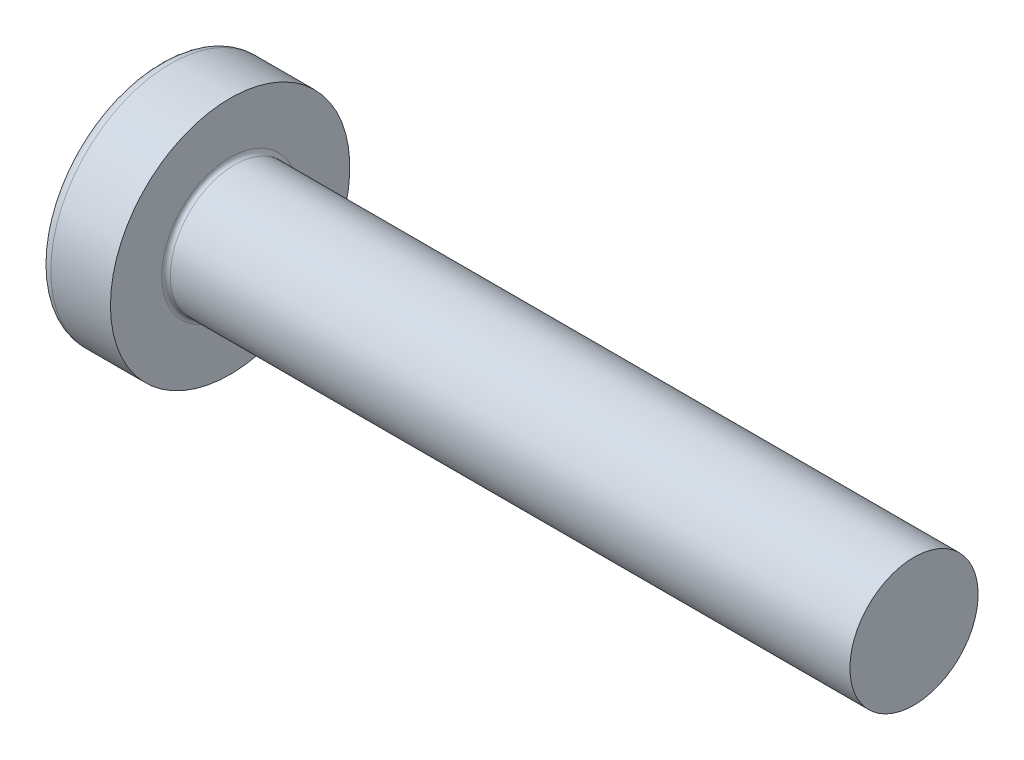
ISO-10303-21;
HEADER;
FILE_DESCRIPTION(('STEP AP214'),'2;1');
FILE_NAME('part.step','',(''),(''),'','','');
FILE_SCHEMA(('AUTOMOTIVE_DESIGN { 1 0 10303 214 1 1 1 1 }'));
ENDSEC;
DATA;
#1=APPLICATION_CONTEXT('core data for automotive mechanical design processes');
#2=APPLICATION_PROTOCOL_DEFINITION('international standard','automotive_design',2000,#1);
#3=PRODUCT_CONTEXT('',#1,'mechanical');
#4=PRODUCT('Part','Part','',(#3));
#5=PRODUCT_RELATED_PRODUCT_CATEGORY('part','',(#4));
#6=PRODUCT_DEFINITION_FORMATION('','',#4);
#7=PRODUCT_DEFINITION_CONTEXT('part definition',#1,'design');
#8=PRODUCT_DEFINITION('design','',#6,#7);
#9=PRODUCT_DEFINITION_SHAPE('','',#8);
#10=(LENGTH_UNIT() NAMED_UNIT(*) SI_UNIT(.MILLI.,.METRE.));
#11=(NAMED_UNIT(*) PLANE_ANGLE_UNIT() SI_UNIT($,.RADIAN.));
#12=(NAMED_UNIT(*) SI_UNIT($,.STERADIAN.) SOLID_ANGLE_UNIT());
#13=UNCERTAINTY_MEASURE_WITH_UNIT(LENGTH_MEASURE(1.E-05),#10,'distance_accuracy_value','');
#14=(GEOMETRIC_REPRESENTATION_CONTEXT(3) GLOBAL_UNCERTAINTY_ASSIGNED_CONTEXT((#13)) GLOBAL_UNIT_ASSIGNED_CONTEXT((#10,
#11,#12)) REPRESENTATION_CONTEXT('',''));
#15=CARTESIAN_POINT('',(0.,0.,0.));
#16=DIRECTION('',(0.,0.,1.));
#17=DIRECTION('',(1.,0.,0.));
#18=AXIS2_PLACEMENT_3D('',#15,#16,#17);
#19=CARTESIAN_POINT('',(5.,0.,0.));
#20=DIRECTION('',(-1.,0.,0.));
#21=DIRECTION('',(0.,1.,0.));
#22=AXIS2_PLACEMENT_3D('',#19,#20,#21);
#23=SPHERICAL_SURFACE('',#22,5.);
#24=CARTESIAN_POINT('',(0.775371598933736,0.,0.));
#25=DIRECTION('',(-1.,0.,0.));
#26=DIRECTION('',(0.,0.,1.));
#27=AXIS2_PLACEMENT_3D('',#24,#25,#26);
#28=CIRCLE('',#27,2.67441860465116);
#29=CARTESIAN_POINT('',(0.775371598933736,0.,2.67441860465116));
#30=VERTEX_POINT('',#29);
#31=EDGE_CURVE('E237',#30,#30,#28,.T.);
#32=ORIENTED_EDGE('',*,*,#31,.T.);
#33=EDGE_LOOP('',(#32));
#34=FACE_BOUND('',#33,.T.);
#35=CARTESIAN_POINT('',(0.0457951200896452,0.,0.));
#36=DIRECTION('',(1.,0.,0.));
#37=DIRECTION('',(0.,0.,-1.));
#38=AXIS2_PLACEMENT_3D('',#35,#36,#37);
#39=CIRCLE('',#38,0.675169614150692);
#40=CARTESIAN_POINT('',(0.0457951200896426,-0.369999999999998,-0.564760133040919));
#41=VERTEX_POINT('',#40);
#42=CARTESIAN_POINT('',(0.0457951200896452,-0.564760133040931,-0.37));
#43=VERTEX_POINT('',#42);
#44=EDGE_CURVE('E373',#41,#43,#39,.F.);
#45=ORIENTED_EDGE('',*,*,#44,.F.);
#46=CARTESIAN_POINT('',(5.,-0.37,0.));
#47=DIRECTION('',(0.,1.,0.));
#48=DIRECTION('',(0.,0.,1.));
#49=AXIS2_PLACEMENT_3D('',#46,#47,#48);
#50=CIRCLE('',#49,4.98629120689917);
#51=CARTESIAN_POINT('',(0.18786973422864,-0.369999999999995,-1.30633162146802));
#52=VERTEX_POINT('',#51);
#53=EDGE_CURVE('E299',#52,#41,#50,.T.);
#54=ORIENTED_EDGE('',*,*,#53,.F.);
#55=CARTESIAN_POINT('',(4.56358262530798,0.,0.875317983305918));
#56=DIRECTION('',(0.446197753347436,0.,-0.894934391398443));
#57=DIRECTION('',(-0.894934391398443,0.,-0.446197753347436));
#58=AXIS2_PLACEMENT_3D('',#55,#56,#57);
#59=CIRCLE('',#58,4.90340272700175);
#60=CARTESIAN_POINT('',(0.187869734228642,0.370000000000005,-1.30633162146801));
#61=VERTEX_POINT('',#60);
#62=EDGE_CURVE('E271',#52,#61,#59,.T.);
#63=ORIENTED_EDGE('',*,*,#62,.T.);
#64=CARTESIAN_POINT('',(5.,0.37,0.));
#65=DIRECTION('',(0.,-1.,0.));
#66=DIRECTION('',(0.,0.,-1.));
#67=AXIS2_PLACEMENT_3D('',#64,#65,#66);
#68=CIRCLE('',#67,4.98629120689917);
#69=CARTESIAN_POINT('',(0.0457951200896447,0.370000000000002,-0.564760133040916));
#70=VERTEX_POINT('',#69);
#71=EDGE_CURVE('E326',#70,#61,#68,.T.);
#72=ORIENTED_EDGE('',*,*,#71,.F.);
#73=CARTESIAN_POINT('',(0.0457951200896452,0.564760133040921,-0.37));
#74=VERTEX_POINT('',#73);
#75=EDGE_CURVE('E392',#74,#70,#39,.F.);
#76=ORIENTED_EDGE('',*,*,#75,.F.);
#77=CARTESIAN_POINT('',(5.,0.,-0.37));
#78=DIRECTION('',(0.,0.,1.));
#79=DIRECTION('',(1.,0.,0.));
#80=AXIS2_PLACEMENT_3D('',#77,#78,#79);
#81=CIRCLE('',#80,4.98629120689917);
#82=CARTESIAN_POINT('',(0.187869734228643,1.30633162146802,-0.37));
#83=VERTEX_POINT('',#82);
#84=EDGE_CURVE('E265',#83,#74,#81,.T.);
#85=ORIENTED_EDGE('',*,*,#84,.F.);
#86=CARTESIAN_POINT('',(4.56358262530798,-0.875317983305921,0.));
#87=DIRECTION('',(0.446197753347436,0.894934391398442,0.));
#88=DIRECTION('',(-0.894934391398442,0.446197753347436,0.));
#89=AXIS2_PLACEMENT_3D('',#86,#87,#88);
#90=CIRCLE('',#89,4.90340272700175);
#91=CARTESIAN_POINT('',(0.187869734228642,1.30633162146802,0.37));
#92=VERTEX_POINT('',#91);
#93=EDGE_CURVE('E268',#83,#92,#90,.T.);
#94=ORIENTED_EDGE('',*,*,#93,.T.);
#95=CARTESIAN_POINT('',(5.,0.,0.37));
#96=DIRECTION('',(0.,0.,-1.));
#97=DIRECTION('',(0.,1.,0.));
#98=AXIS2_PLACEMENT_3D('',#95,#96,#97);
#99=CIRCLE('',#98,4.98629120689917);
#100=CARTESIAN_POINT('',(0.0457951200896452,0.564760133040921,0.37));
#101=VERTEX_POINT('',#100);
#102=EDGE_CURVE('E261',#101,#92,#99,.T.);
#103=ORIENTED_EDGE('',*,*,#102,.F.);
#104=CARTESIAN_POINT('',(0.0457951200896452,0.369999999999998,0.564760133040918));
#105=VERTEX_POINT('',#104);
#106=EDGE_CURVE('E391',#105,#101,#39,.F.);
#107=ORIENTED_EDGE('',*,*,#106,.F.);
#108=CARTESIAN_POINT('',(0.187869734228642,0.369999999999995,1.30633162146802));
#109=VERTEX_POINT('',#108);
#110=EDGE_CURVE('E281',#109,#105,#68,.T.);
#111=ORIENTED_EDGE('',*,*,#110,.F.);
#112=CARTESIAN_POINT('',(4.56358262530798,0.,-0.87531798330592));
#113=DIRECTION('',(0.446197753347436,0.,0.894934391398442));
#114=DIRECTION('',(0.894934391398442,0.,-0.446197753347436));
#115=AXIS2_PLACEMENT_3D('',#112,#113,#114);
#116=CIRCLE('',#115,4.90340272700175);
#117=CARTESIAN_POINT('',(0.18786973422864,-0.370000000000004,1.30633162146802));
#118=VERTEX_POINT('',#117);
#119=EDGE_CURVE('E48',#109,#118,#116,.T.);
#120=ORIENTED_EDGE('',*,*,#119,.T.);
#121=CARTESIAN_POINT('',(0.0457951200896416,-0.370000000000002,0.564760133040916));
#122=VERTEX_POINT('',#121);
#123=EDGE_CURVE('E278',#122,#118,#50,.T.);
#124=ORIENTED_EDGE('',*,*,#123,.F.);
#125=CARTESIAN_POINT('',(0.0457951200896452,-0.564760133040931,0.37));
#126=VERTEX_POINT('',#125);
#127=EDGE_CURVE('E431',#126,#122,#39,.F.);
#128=ORIENTED_EDGE('',*,*,#127,.F.);
#129=CARTESIAN_POINT('',(0.187869734228639,-1.30633162146802,0.37));
#130=VERTEX_POINT('',#129);
#131=EDGE_CURVE('E262',#130,#126,#99,.T.);
#132=ORIENTED_EDGE('',*,*,#131,.F.);
#133=CARTESIAN_POINT('',(4.56358262530798,0.875317983305917,0.));
#134=DIRECTION('',(0.446197753347436,-0.894934391398443,0.));
#135=DIRECTION('',(0.894934391398443,0.446197753347436,0.));
#136=AXIS2_PLACEMENT_3D('',#133,#134,#135);
#137=CIRCLE('',#136,4.90340272700175);
#138=CARTESIAN_POINT('',(0.187869734228639,-1.30633162146802,-0.37));
#139=VERTEX_POINT('',#138);
#140=EDGE_CURVE('E258',#130,#139,#137,.T.);
#141=ORIENTED_EDGE('',*,*,#140,.T.);
#142=EDGE_CURVE('E63',#43,#139,#81,.T.);
#143=ORIENTED_EDGE('',*,*,#142,.F.);
#144=EDGE_LOOP('',(#45,#54,#63,#72,#76,#85,#94,#103,#107,#111,#120,#124,#128,#132,#141,#143));
#145=FACE_BOUND('',#144,.T.);
#146=ADVANCED_FACE('F34',(#34,#145),#23,.T.);
#147=CARTESIAN_POINT('',(1.75,0.527482331818931,-0.37));
#148=DIRECTION('',(0.,0.,1.));
#149=DIRECTION('',(1.,0.,0.));
#150=AXIS2_PLACEMENT_3D('',#147,#148,#149);
#151=PLANE('',#150);
#152=ORIENTED_EDGE('',*,*,#84,.T.);
#153=CARTESIAN_POINT('',(-0.987293237053714,0.649401255967161,-0.37));
#154=CARTESIAN_POINT('',(-0.781914975317082,0.632865887002871,-0.37));
#155=CARTESIAN_POINT('',(-0.57654788239337,0.616188977635081,-0.37));
#156=CARTESIAN_POINT('',(-0.165841599226325,0.582441031964227,-0.37));
#157=CARTESIAN_POINT('',(0.0394975903090468,0.565369987054879,-0.37));
#158=CARTESIAN_POINT('',(0.450133475422574,0.530723441326535,-0.37));
#159=CARTESIAN_POINT('',(0.655430171010575,0.513147940624557,-0.37));
#160=CARTESIAN_POINT('',(1.06596140177934,0.477314957985794,-0.37));
#161=CARTESIAN_POINT('',(1.27119593780711,0.459057485806066,-0.37));
#162=CARTESIAN_POINT('',(1.61065292365626,0.428051938688768,-0.37));
#163=CARTESIAN_POINT('',(1.74490059995643,0.415580824990931,-0.37));
#164=CARTESIAN_POINT('',(2.01334321762763,0.390092023404979,-0.37));
#165=CARTESIAN_POINT('',(2.14753815934577,0.377074339177353,-0.37));
#166=CARTESIAN_POINT('',(2.41586354151957,0.350315629452842,-0.37));
#167=CARTESIAN_POINT('',(2.5499939784531,0.33657456817765,-0.37));
#168=CARTESIAN_POINT('',(2.81814173295471,0.308004077741875,-0.37));
#169=CARTESIAN_POINT('',(2.95215904765134,0.293174621747065,-0.37));
#170=CARTESIAN_POINT('',(3.0860955068368,0.277618485071816,-0.37));
#171=B_SPLINE_CURVE_WITH_KNOTS('',3,(#153,#154,#155,#156,#157,#158,#159,#160,#161,#162,#163,
#164,#165,#166,#167,#168,#169,#170),.UNSPECIFIED.,.F.,.F.,(4,2,2,2,2,2,2,2,4),(0.,
0.618128793984691,1.23627109812525,1.85441325887562,2.4725465791681,2.87702276218609,
3.28149623678161,3.68598973550942,4.09049321032311),.UNSPECIFIED.);
#172=CARTESIAN_POINT('',(1.75,0.415013252800437,-0.37));
#173=VERTEX_POINT('',#172);
#174=EDGE_CURVE('E415',#74,#173,#171,.T.);
#175=ORIENTED_EDGE('',*,*,#174,.T.);
#176=DIRECTION('',(0.,1.,0.));
#177=VECTOR('',#176,1.);
#178=CARTESIAN_POINT('',(1.75,-0.527482331818931,-0.37));
#179=LINE('',#178,#177);
#180=CARTESIAN_POINT('',(1.75,0.527482331818931,-0.37));
#181=VERTEX_POINT('',#180);
#182=EDGE_CURVE('E355',#173,#181,#179,.T.);
#183=ORIENTED_EDGE('',*,*,#182,.T.);
#184=DIRECTION('',(0.894934391398442,-0.446197753347436,0.));
#185=VECTOR('',#184,1.);
#186=CARTESIAN_POINT('',(0.,1.4,-0.37));
#187=LINE('',#186,#185);
#188=EDGE_CURVE('E238',#83,#181,#187,.T.);
#189=ORIENTED_EDGE('',*,*,#188,.F.);
#190=EDGE_LOOP('',(#152,#175,#183,#189));
#191=FACE_BOUND('',#190,.T.);
#192=ADVANCED_FACE('F193',(#191),#151,.T.);
#193=CARTESIAN_POINT('',(1.75,-0.527482331818931,-0.37));
#194=VERTEX_POINT('',#193);
#195=CARTESIAN_POINT('',(1.75,-0.415013252800437,-0.37));
#196=VERTEX_POINT('',#195);
#197=EDGE_CURVE('E246',#194,#196,#179,.T.);
#198=ORIENTED_EDGE('',*,*,#197,.T.);
#199=CARTESIAN_POINT('',(-0.987293237053716,-0.649401255967161,-0.37));
#200=CARTESIAN_POINT('',(-0.781914975317084,-0.632865887002871,-0.37));
#201=CARTESIAN_POINT('',(-0.576547882393373,-0.616188977635081,-0.37));
#202=CARTESIAN_POINT('',(-0.165841599226327,-0.582441031964227,-0.37));
#203=CARTESIAN_POINT('',(0.0394975903090452,-0.565369987054879,-0.37));
#204=CARTESIAN_POINT('',(0.450133475422572,-0.530723441326535,-0.37));
#205=CARTESIAN_POINT('',(0.655430171010574,-0.513147940624557,-0.37));
#206=CARTESIAN_POINT('',(1.06596140177934,-0.477314957985794,-0.37));
#207=CARTESIAN_POINT('',(1.2711959378071,-0.459057485806066,-0.37));
#208=CARTESIAN_POINT('',(1.61065292365626,-0.428051938688768,-0.37));
#209=CARTESIAN_POINT('',(1.74490059995643,-0.415580824990931,-0.37));
#210=CARTESIAN_POINT('',(2.01334321762763,-0.390092023404979,-0.37));
#211=CARTESIAN_POINT('',(2.14753815934577,-0.377074339177353,-0.37));
#212=CARTESIAN_POINT('',(2.41586354151957,-0.350315629452842,-0.37));
#213=CARTESIAN_POINT('',(2.5499939784531,-0.33657456817765,-0.37));
#214=CARTESIAN_POINT('',(2.81814173295471,-0.308004077741875,-0.37));
#215=CARTESIAN_POINT('',(2.95215904765134,-0.293174621747065,-0.37));
#216=CARTESIAN_POINT('',(3.0860955068368,-0.277618485071816,-0.37));
#217=B_SPLINE_CURVE_WITH_KNOTS('',3,(#199,#200,#201,#202,#203,#204,#205,#206,#207,#208,#209,
#210,#211,#212,#213,#214,#215,#216),.UNSPECIFIED.,.F.,.F.,(4,2,2,2,2,2,2,2,4),(0.,
0.618128793984691,1.23627109812525,1.85441325887562,2.4725465791681,2.87702276218609,
3.28149623678161,3.68598973550942,4.09049321032311),.UNSPECIFIED.);
#218=EDGE_CURVE('E390',#196,#43,#217,.F.);
#219=ORIENTED_EDGE('',*,*,#218,.T.);
#220=ORIENTED_EDGE('',*,*,#142,.T.);
#221=DIRECTION('',(0.894934391398443,0.446197753347436,0.));
#222=VECTOR('',#221,1.);
#223=CARTESIAN_POINT('',(0.,-1.4,-0.37));
#224=LINE('',#223,#222);
#225=EDGE_CURVE('E329',#139,#194,#224,.T.);
#226=ORIENTED_EDGE('',*,*,#225,.T.);
#227=EDGE_LOOP('',(#198,#219,#220,#226));
#228=FACE_BOUND('',#227,.T.);
#229=ADVANCED_FACE('F199',(#228),#151,.T.);
#230=CARTESIAN_POINT('',(1.75,-0.527482331818932,0.37));
#231=DIRECTION('',(0.,0.,-1.));
#232=DIRECTION('',(0.,1.,0.));
#233=AXIS2_PLACEMENT_3D('',#230,#231,#232);
#234=PLANE('',#233);
#235=DIRECTION('',(0.,-1.,0.));
#236=VECTOR('',#235,1.);
#237=CARTESIAN_POINT('',(1.75,0.527482331818931,0.37));
#238=LINE('',#237,#236);
#239=CARTESIAN_POINT('',(1.75,0.527482331818931,0.37));
#240=VERTEX_POINT('',#239);
#241=CARTESIAN_POINT('',(1.75,0.415013252800437,0.37));
#242=VERTEX_POINT('',#241);
#243=EDGE_CURVE('E338',#240,#242,#238,.T.);
#244=ORIENTED_EDGE('',*,*,#243,.T.);
#245=CARTESIAN_POINT('',(-0.987293237069634,0.649401255968442,0.37));
#246=CARTESIAN_POINT('',(-0.7819149753313,0.632865887004023,0.37));
#247=CARTESIAN_POINT('',(-0.576547882405887,0.616188977636103,0.37));
#248=CARTESIAN_POINT('',(-0.165841599235439,0.582441031964983,0.37));
#249=CARTESIAN_POINT('',(0.0394975903016343,0.5653699870555,0.37));
#250=CARTESIAN_POINT('',(0.450133475420602,0.530723441326706,0.37));
#251=CARTESIAN_POINT('',(0.655430171012341,0.513147940624409,0.37));
#252=CARTESIAN_POINT('',(1.06596140178858,0.477314957984981,0.37));
#253=CARTESIAN_POINT('',(1.27119593782008,0.459057485804908,0.37));
#254=CARTESIAN_POINT('',(1.61065292367297,0.428051938687225,0.37));
#255=CARTESIAN_POINT('',(1.74490059997313,0.415580824989367,0.37));
#256=CARTESIAN_POINT('',(2.01334321764434,0.390092023403371,0.37));
#257=CARTESIAN_POINT('',(2.14753815936247,0.377074339175718,0.37));
#258=CARTESIAN_POINT('',(2.41586354153627,0.350315629451146,0.37));
#259=CARTESIAN_POINT('',(2.54999397846979,0.336574568175918,0.37));
#260=CARTESIAN_POINT('',(2.8181417329714,0.308004077740054,0.37));
#261=CARTESIAN_POINT('',(2.95215904766802,0.293174621745189,0.37));
#262=CARTESIAN_POINT('',(3.08609550685347,0.277618485069873,0.37));
#263=B_SPLINE_CURVE_WITH_KNOTS('',3,(#245,#246,#247,#248,#249,#250,#251,#252,#253,#254,#255,
#256,#257,#258,#259,#260,#261,#262),.UNSPECIFIED.,.F.,.F.,(4,2,2,2,2,2,2,2,4),(0.,
0.61812879398981,1.23627109813549,1.85441325889711,2.47254657920086,2.87702276221884,
3.28149623681436,3.68598973554217,4.09049321035586),.UNSPECIFIED.);
#264=EDGE_CURVE('E670',#242,#101,#263,.F.);
#265=ORIENTED_EDGE('',*,*,#264,.T.);
#266=ORIENTED_EDGE('',*,*,#102,.T.);
#267=DIRECTION('',(0.894934391398442,-0.446197753347436,0.));
#268=VECTOR('',#267,1.);
#269=CARTESIAN_POINT('',(0.,1.4,0.37));
#270=LINE('',#269,#268);
#271=EDGE_CURVE('E243',#92,#240,#270,.T.);
#272=ORIENTED_EDGE('',*,*,#271,.T.);
#273=EDGE_LOOP('',(#244,#265,#266,#272));
#274=FACE_BOUND('',#273,.T.);
#275=ADVANCED_FACE('F411',(#274),#234,.T.);
#276=ORIENTED_EDGE('',*,*,#131,.T.);
#277=CARTESIAN_POINT('',(-0.987293237069634,-0.649401255968442,0.37));
#278=CARTESIAN_POINT('',(-0.7819149753313,-0.632865887004024,0.37));
#279=CARTESIAN_POINT('',(-0.576547882405887,-0.616188977636103,0.37));
#280=CARTESIAN_POINT('',(-0.165841599235439,-0.582441031964983,0.37));
#281=CARTESIAN_POINT('',(0.0394975903016343,-0.5653699870555,0.37));
#282=CARTESIAN_POINT('',(0.450133475420602,-0.530723441326706,0.37));
#283=CARTESIAN_POINT('',(0.655430171012341,-0.513147940624409,0.37));
#284=CARTESIAN_POINT('',(1.06596140178858,-0.477314957984981,0.37));
#285=CARTESIAN_POINT('',(1.27119593782008,-0.459057485804908,0.37));
#286=CARTESIAN_POINT('',(1.61065292367297,-0.428051938687225,0.37));
#287=CARTESIAN_POINT('',(1.74490059997313,-0.415580824989367,0.37));
#288=CARTESIAN_POINT('',(2.01334321764434,-0.390092023403371,0.37));
#289=CARTESIAN_POINT('',(2.14753815936247,-0.377074339175718,0.37));
#290=CARTESIAN_POINT('',(2.41586354153627,-0.350315629451146,0.37));
#291=CARTESIAN_POINT('',(2.54999397846979,-0.336574568175918,0.37));
#292=CARTESIAN_POINT('',(2.8181417329714,-0.308004077740054,0.37));
#293=CARTESIAN_POINT('',(2.95215904766802,-0.29317462174519,0.37));
#294=CARTESIAN_POINT('',(3.08609550685347,-0.277618485069873,0.37));
#295=B_SPLINE_CURVE_WITH_KNOTS('',3,(#277,#278,#279,#280,#281,#282,#283,#284,#285,#286,#287,
#288,#289,#290,#291,#292,#293,#294),.UNSPECIFIED.,.F.,.F.,(4,2,2,2,2,2,2,2,4),(0.,
0.61812879398981,1.23627109813549,1.85441325889711,2.47254657920086,2.87702276221884,
3.28149623681436,3.68598973554217,4.09049321035586),.UNSPECIFIED.);
#296=CARTESIAN_POINT('',(1.75,-0.415013252800437,0.37));
#297=VERTEX_POINT('',#296);
#298=EDGE_CURVE('E432',#126,#297,#295,.T.);
#299=ORIENTED_EDGE('',*,*,#298,.T.);
#300=CARTESIAN_POINT('',(1.75,-0.527482331818932,0.37));
#301=VERTEX_POINT('',#300);
#302=EDGE_CURVE('E340',#297,#301,#238,.T.);
#303=ORIENTED_EDGE('',*,*,#302,.T.);
#304=DIRECTION('',(0.894934391398443,0.446197753347436,0.));
#305=VECTOR('',#304,1.);
#306=CARTESIAN_POINT('',(0.,-1.4,0.37));
#307=LINE('',#306,#305);
#308=EDGE_CURVE('E331',#130,#301,#307,.T.);
#309=ORIENTED_EDGE('',*,*,#308,.F.);
#310=EDGE_LOOP('',(#276,#299,#303,#309));
#311=FACE_BOUND('',#310,.T.);
#312=ADVANCED_FACE('F518',(#311),#234,.T.);
#313=CARTESIAN_POINT('',(1.75,0.527482331818931,0.37));
#314=DIRECTION('',(0.446197753347436,0.894934391398442,0.));
#315=DIRECTION('',(-0.894934391398442,0.446197753347436,0.));
#316=AXIS2_PLACEMENT_3D('',#313,#314,#315);
#317=PLANE('',#316);
#318=CARTESIAN_POINT('',(2.6696526882832,0.0689604923233258,0.));
#319=DIRECTION('',(0.446197753347436,0.894934391398442,0.));
#320=DIRECTION('',(-0.894934391398442,0.446197753347436,0.));
#321=AXIS2_PLACEMENT_3D('',#318,#319,#320);
#322=ELLIPSE('',#321,1.10195897609153,0.486831694838766);
#323=CARTESIAN_POINT('',(1.75,0.527482331818932,0.175779377683682));
#324=VERTEX_POINT('',#323);
#325=CARTESIAN_POINT('',(1.75,0.527482331818932,-0.175779377683682));
#326=VERTEX_POINT('',#325);
#327=EDGE_CURVE('E304',#324,#326,#322,.F.);
#328=ORIENTED_EDGE('',*,*,#327,.F.);
#329=DIRECTION('',(0.,0.,-1.));
#330=VECTOR('',#329,1.);
#331=CARTESIAN_POINT('',(1.75,0.527482331818931,0.37));
#332=LINE('',#331,#330);
#333=EDGE_CURVE('E341',#240,#324,#332,.T.);
#334=ORIENTED_EDGE('',*,*,#333,.F.);
#335=ORIENTED_EDGE('',*,*,#271,.F.);
#336=ORIENTED_EDGE('',*,*,#93,.F.);
#337=ORIENTED_EDGE('',*,*,#188,.T.);
#338=EDGE_CURVE('E343',#326,#181,#332,.T.);
#339=ORIENTED_EDGE('',*,*,#338,.F.);
#340=EDGE_LOOP('',(#328,#334,#335,#336,#337,#339));
#341=FACE_BOUND('',#340,.T.);
#342=ADVANCED_FACE('F409',(#341),#317,.F.);
#343=CARTESIAN_POINT('',(0.,-1.4,-0.37));
#344=DIRECTION('',(0.446197753347436,-0.894934391398443,0.));
#345=DIRECTION('',(0.894934391398443,0.446197753347436,0.));
#346=AXIS2_PLACEMENT_3D('',#343,#344,#345);
#347=PLANE('',#346);
#348=CARTESIAN_POINT('',(2.6696526882832,-0.0689604923233255,0.));
#349=DIRECTION('',(0.446197753347436,-0.894934391398443,0.));
#350=DIRECTION('',(-0.894934391398443,-0.446197753347436,0.));
#351=AXIS2_PLACEMENT_3D('',#348,#349,#350);
#352=ELLIPSE('',#351,1.10195897609154,0.486831694838766);
#353=CARTESIAN_POINT('',(1.75,-0.527482331818932,-0.175779377683681));
#354=VERTEX_POINT('',#353);
#355=CARTESIAN_POINT('',(1.75,-0.527482331818932,0.17577937768368));
#356=VERTEX_POINT('',#355);
#357=EDGE_CURVE('E672',#354,#356,#352,.F.);
#358=ORIENTED_EDGE('',*,*,#357,.F.);
#359=DIRECTION('',(0.,0.,1.));
#360=VECTOR('',#359,1.);
#361=CARTESIAN_POINT('',(1.75,-0.527482331818931,-0.37));
#362=LINE('',#361,#360);
#363=EDGE_CURVE('E334',#194,#354,#362,.T.);
#364=ORIENTED_EDGE('',*,*,#363,.F.);
#365=ORIENTED_EDGE('',*,*,#225,.F.);
#366=ORIENTED_EDGE('',*,*,#140,.F.);
#367=ORIENTED_EDGE('',*,*,#308,.T.);
#368=EDGE_CURVE('E337',#356,#301,#362,.T.);
#369=ORIENTED_EDGE('',*,*,#368,.F.);
#370=EDGE_LOOP('',(#358,#364,#365,#366,#367,#369));
#371=FACE_BOUND('',#370,.T.);
#372=ADVANCED_FACE('F505',(#371),#347,.F.);
#373=CARTESIAN_POINT('',(1.75,0.527482331818931,-0.37));
#374=DIRECTION('',(-1.,0.,0.));
#375=DIRECTION('',(0.,0.,1.));
#376=AXIS2_PLACEMENT_3D('',#373,#374,#375);
#377=PLANE('',#376);
#378=DIRECTION('',(0.,1.,0.));
#379=VECTOR('',#378,1.);
#380=CARTESIAN_POINT('',(1.75,-0.370000000000002,0.52748233181893));
#381=LINE('',#380,#379);
#382=CARTESIAN_POINT('',(1.75,-0.370000000000002,0.52748233181893));
#383=VERTEX_POINT('',#382);
#384=CARTESIAN_POINT('',(1.75,-0.175779377683686,0.52748233181893));
#385=VERTEX_POINT('',#384);
#386=EDGE_CURVE('E319',#383,#385,#381,.T.);
#387=ORIENTED_EDGE('',*,*,#386,.T.);
#388=CARTESIAN_POINT('',(1.75,0.,0.));
#389=DIRECTION('',(-1.,0.,0.));
#390=DIRECTION('',(0.,0.,1.));
#391=AXIS2_PLACEMENT_3D('',#388,#389,#390);
#392=CIRCLE('',#391,0.556);
#393=CARTESIAN_POINT('',(1.75,-0.370000000000001,0.415013252800437));
#394=VERTEX_POINT('',#393);
#395=EDGE_CURVE('E700',#394,#385,#392,.T.);
#396=ORIENTED_EDGE('',*,*,#395,.F.);
#397=DIRECTION('',(0.,0.,-1.));
#398=VECTOR('',#397,1.);
#399=CARTESIAN_POINT('',(1.75,-0.370000000000002,0.52748233181893));
#400=LINE('',#399,#398);
#401=EDGE_CURVE('E315',#383,#394,#400,.T.);
#402=ORIENTED_EDGE('',*,*,#401,.F.);
#403=EDGE_LOOP('',(#387,#396,#402));
#404=FACE_BOUND('',#403,.T.);
#405=ADVANCED_FACE('F498',(#404),#377,.T.);
#406=ORIENTED_EDGE('',*,*,#302,.F.);
#407=EDGE_CURVE('E705',#356,#297,#392,.T.);
#408=ORIENTED_EDGE('',*,*,#407,.F.);
#409=ORIENTED_EDGE('',*,*,#368,.T.);
#410=EDGE_LOOP('',(#406,#408,#409));
#411=FACE_BOUND('',#410,.T.);
#412=ADVANCED_FACE('F491',(#411),#377,.T.);
#413=ORIENTED_EDGE('',*,*,#363,.T.);
#414=EDGE_CURVE('E384',#196,#354,#392,.T.);
#415=ORIENTED_EDGE('',*,*,#414,.F.);
#416=ORIENTED_EDGE('',*,*,#197,.F.);
#417=EDGE_LOOP('',(#413,#415,#416));
#418=FACE_BOUND('',#417,.T.);
#419=ADVANCED_FACE('F485',(#418),#377,.T.);
#420=CARTESIAN_POINT('',(1.75,-0.369999999999998,-0.415013252800438));
#421=VERTEX_POINT('',#420);
#422=CARTESIAN_POINT('',(1.75,-0.369999999999998,-0.527482331818933));
#423=VERTEX_POINT('',#422);
#424=EDGE_CURVE('E318',#421,#423,#400,.T.);
#425=ORIENTED_EDGE('',*,*,#424,.F.);
#426=CARTESIAN_POINT('',(1.75,-0.17577937768368,-0.527482331818932));
#427=VERTEX_POINT('',#426);
#428=EDGE_CURVE('E55',#427,#421,#392,.T.);
#429=ORIENTED_EDGE('',*,*,#428,.F.);
#430=DIRECTION('',(0.,-1.,0.));
#431=VECTOR('',#430,1.);
#432=CARTESIAN_POINT('',(1.75,0.370000000000002,-0.52748233181893));
#433=LINE('',#432,#431);
#434=EDGE_CURVE('E314',#427,#423,#433,.T.);
#435=ORIENTED_EDGE('',*,*,#434,.T.);
#436=EDGE_LOOP('',(#425,#429,#435));
#437=FACE_BOUND('',#436,.T.);
#438=ADVANCED_FACE('F379',(#437),#377,.T.);
#439=CARTESIAN_POINT('',(1.75,0.370000000000002,-0.52748233181893));
#440=VERTEX_POINT('',#439);
#441=CARTESIAN_POINT('',(1.75,0.175779377683684,-0.527482331818931));
#442=VERTEX_POINT('',#441);
#443=EDGE_CURVE('E311',#440,#442,#433,.T.);
#444=ORIENTED_EDGE('',*,*,#443,.T.);
#445=CARTESIAN_POINT('',(1.75,0.370000000000001,-0.415013252800436));
#446=VERTEX_POINT('',#445);
#447=EDGE_CURVE('E383',#446,#442,#392,.T.);
#448=ORIENTED_EDGE('',*,*,#447,.F.);
#449=DIRECTION('',(0.,0.,1.));
#450=VECTOR('',#449,1.);
#451=CARTESIAN_POINT('',(1.75,0.370000000000002,-0.52748233181893));
#452=LINE('',#451,#450);
#453=EDGE_CURVE('E323',#440,#446,#452,.T.);
#454=ORIENTED_EDGE('',*,*,#453,.F.);
#455=EDGE_LOOP('',(#444,#448,#454));
#456=FACE_BOUND('',#455,.T.);
#457=ADVANCED_FACE('F473',(#456),#377,.T.);
#458=ORIENTED_EDGE('',*,*,#182,.F.);
#459=EDGE_CURVE('E689',#326,#173,#392,.T.);
#460=ORIENTED_EDGE('',*,*,#459,.F.);
#461=ORIENTED_EDGE('',*,*,#338,.T.);
#462=EDGE_LOOP('',(#458,#460,#461));
#463=FACE_BOUND('',#462,.T.);
#464=ADVANCED_FACE('F466',(#463),#377,.T.);
#465=ORIENTED_EDGE('',*,*,#333,.T.);
#466=EDGE_CURVE('E691',#242,#324,#392,.T.);
#467=ORIENTED_EDGE('',*,*,#466,.F.);
#468=ORIENTED_EDGE('',*,*,#243,.F.);
#469=EDGE_LOOP('',(#465,#467,#468));
#470=FACE_BOUND('',#469,.T.);
#471=ADVANCED_FACE('F460',(#470),#377,.T.);
#472=CARTESIAN_POINT('',(1.75,0.369999999999998,0.527482331818932));
#473=DIRECTION('',(0.,-1.,0.));
#474=DIRECTION('',(1.,0.,0.));
#475=AXIS2_PLACEMENT_3D('',#472,#473,#474);
#476=PLANE('',#475);
#477=ORIENTED_EDGE('',*,*,#110,.T.);
#478=CARTESIAN_POINT('',(-0.987293237069634,0.369999999999998,0.649401255968443));
#479=CARTESIAN_POINT('',(-0.7819149753313,0.369999999999998,0.632865887004024));
#480=CARTESIAN_POINT('',(-0.576547882405887,0.369999999999998,0.616188977636104));
#481=CARTESIAN_POINT('',(-0.165841599235439,0.369999999999998,0.582441031964984));
#482=CARTESIAN_POINT('',(0.0394975903016347,0.369999999999998,0.565369987055501));
#483=CARTESIAN_POINT('',(0.450133475420603,0.369999999999998,0.530723441326707));
#484=CARTESIAN_POINT('',(0.655430171012342,0.369999999999998,0.51314794062441));
#485=CARTESIAN_POINT('',(1.06596140178858,0.369999999999998,0.477314957984982));
#486=CARTESIAN_POINT('',(1.27119593782008,0.369999999999998,0.459057485804909));
#487=CARTESIAN_POINT('',(1.61065292367297,0.369999999999999,0.428051938687226));
#488=CARTESIAN_POINT('',(1.74490059997313,0.369999999999999,0.415580824989369));
#489=CARTESIAN_POINT('',(2.01334321764434,0.369999999999999,0.390092023403372));
#490=CARTESIAN_POINT('',(2.14753815936247,0.369999999999999,0.377074339175719));
#491=CARTESIAN_POINT('',(2.41586354153627,0.369999999999999,0.350315629451147));
#492=CARTESIAN_POINT('',(2.54999397846979,0.369999999999999,0.336574568175919));
#493=CARTESIAN_POINT('',(2.8181417329714,0.369999999999999,0.308004077740055));
#494=CARTESIAN_POINT('',(2.95215904766802,0.369999999999999,0.293174621745191));
#495=CARTESIAN_POINT('',(3.08609550685347,0.369999999999999,0.277618485069874));
#496=B_SPLINE_CURVE_WITH_KNOTS('',3,(#478,#479,#480,#481,#482,#483,#484,#485,#486,#487,#488,
#489,#490,#491,#492,#493,#494,#495),.UNSPECIFIED.,.F.,.F.,(4,2,2,2,2,2,2,2,4),(0.,
0.61812879398981,1.2362710981355,1.85441325889711,2.47254657920086,2.87702276221884,
3.28149623681436,3.68598973554217,4.09049321035586),.UNSPECIFIED.);
#497=CARTESIAN_POINT('',(1.75,0.369999999999999,0.415013252800439));
#498=VERTEX_POINT('',#497);
#499=EDGE_CURVE('E669',#105,#498,#496,.T.);
#500=ORIENTED_EDGE('',*,*,#499,.T.);
#501=CARTESIAN_POINT('',(1.75,0.369999999999998,0.527482331818932));
#502=VERTEX_POINT('',#501);
#503=EDGE_CURVE('E296',#498,#502,#452,.T.);
#504=ORIENTED_EDGE('',*,*,#503,.T.);
#505=DIRECTION('',(0.894934391398442,0.,-0.446197753347436));
#506=VECTOR('',#505,1.);
#507=CARTESIAN_POINT('',(0.,0.369999999999995,1.4));
#508=LINE('',#507,#506);
#509=EDGE_CURVE('E289',#109,#502,#508,.T.);
#510=ORIENTED_EDGE('',*,*,#509,.F.);
#511=EDGE_LOOP('',(#477,#500,#504,#510));
#512=FACE_BOUND('',#511,.T.);
#513=ADVANCED_FACE('F293',(#512),#476,.T.);
#514=CARTESIAN_POINT('',(1.75,-0.369999999999998,-0.527482331818933));
#515=DIRECTION('',(0.,1.,0.));
#516=DIRECTION('',(0.,0.,1.));
#517=AXIS2_PLACEMENT_3D('',#514,#515,#516);
#518=PLANE('',#517);
#519=ORIENTED_EDGE('',*,*,#401,.T.);
#520=CARTESIAN_POINT('',(-0.987293237053715,-0.370000000000002,0.64940125596716));
#521=CARTESIAN_POINT('',(-0.781914975317083,-0.370000000000002,0.63286588700287));
#522=CARTESIAN_POINT('',(-0.576547882393372,-0.370000000000002,0.61618897763508));
#523=CARTESIAN_POINT('',(-0.165841599226326,-0.370000000000002,0.582441031964226));
#524=CARTESIAN_POINT('',(0.0394975903090458,-0.370000000000002,0.565369987054878));
#525=CARTESIAN_POINT('',(0.450133475422573,-0.370000000000002,0.530723441326534));
#526=CARTESIAN_POINT('',(0.655430171010574,-0.370000000000002,0.513147940624556));
#527=CARTESIAN_POINT('',(1.06596140177934,-0.370000000000002,0.477314957985793));
#528=CARTESIAN_POINT('',(1.2711959378071,-0.370000000000001,0.459057485806065));
#529=CARTESIAN_POINT('',(1.61065292365626,-0.370000000000001,0.428051938688767));
#530=CARTESIAN_POINT('',(1.74490059995643,-0.370000000000001,0.41558082499093));
#531=CARTESIAN_POINT('',(2.01334321762763,-0.370000000000001,0.390092023404978));
#532=CARTESIAN_POINT('',(2.14753815934577,-0.370000000000001,0.377074339177352));
#533=CARTESIAN_POINT('',(2.41586354151957,-0.370000000000001,0.350315629452841));
#534=CARTESIAN_POINT('',(2.5499939784531,-0.370000000000001,0.336574568177649));
#535=CARTESIAN_POINT('',(2.81814173295471,-0.370000000000001,0.308004077741874));
#536=CARTESIAN_POINT('',(2.95215904765134,-0.370000000000001,0.293174621747064));
#537=CARTESIAN_POINT('',(3.0860955068368,-0.370000000000001,0.277618485071814));
#538=B_SPLINE_CURVE_WITH_KNOTS('',3,(#520,#521,#522,#523,#524,#525,#526,#527,#528,#529,#530,
#531,#532,#533,#534,#535,#536,#537),.UNSPECIFIED.,.F.,.F.,(4,2,2,2,2,2,2,2,4),(0.,
0.61812879398469,1.23627109812525,1.85441325887562,2.4725465791681,2.87702276218609,
3.28149623678161,3.68598973550942,4.09049321032311),.UNSPECIFIED.);
#539=EDGE_CURVE('E424',#394,#122,#538,.F.);
#540=ORIENTED_EDGE('',*,*,#539,.T.);
#541=ORIENTED_EDGE('',*,*,#123,.T.);
#542=DIRECTION('',(0.894934391398442,0.,-0.446197753347436));
#543=VECTOR('',#542,1.);
#544=CARTESIAN_POINT('',(0.,-0.370000000000005,1.4));
#545=LINE('',#544,#543);
#546=EDGE_CURVE('E291',#118,#383,#545,.T.);
#547=ORIENTED_EDGE('',*,*,#546,.T.);
#548=EDGE_LOOP('',(#519,#540,#541,#547));
#549=FACE_BOUND('',#548,.T.);
#550=ADVANCED_FACE('F228',(#549),#518,.T.);
#551=CARTESIAN_POINT('',(1.75,-0.370000000000002,0.52748233181893));
#552=DIRECTION('',(0.446197753347436,0.,0.894934391398442));
#553=DIRECTION('',(-0.894934391398442,0.,0.446197753347436));
#554=AXIS2_PLACEMENT_3D('',#551,#552,#553);
#555=PLANE('',#554);
#556=CARTESIAN_POINT('',(2.6696526882832,0.,0.0689604923233258));
#557=DIRECTION('',(0.446197753347436,0.,0.894934391398442));
#558=DIRECTION('',(-0.894934391398442,0.,0.446197753347436));
#559=AXIS2_PLACEMENT_3D('',#556,#557,#558);
#560=ELLIPSE('',#559,1.10195897609153,0.486831694838766);
#561=CARTESIAN_POINT('',(1.75,0.175779377683682,0.527482331818932));
#562=VERTEX_POINT('',#561);
#563=EDGE_CURVE('E422',#385,#562,#560,.F.);
#564=ORIENTED_EDGE('',*,*,#563,.F.);
#565=ORIENTED_EDGE('',*,*,#386,.F.);
#566=ORIENTED_EDGE('',*,*,#546,.F.);
#567=ORIENTED_EDGE('',*,*,#119,.F.);
#568=ORIENTED_EDGE('',*,*,#509,.T.);
#569=EDGE_CURVE('E322',#562,#502,#381,.T.);
#570=ORIENTED_EDGE('',*,*,#569,.F.);
#571=EDGE_LOOP('',(#564,#565,#566,#567,#568,#570));
#572=FACE_BOUND('',#571,.T.);
#573=ADVANCED_FACE('F287',(#572),#555,.F.);
#574=CARTESIAN_POINT('',(0.,0.370000000000005,-1.4));
#575=DIRECTION('',(0.446197753347436,0.,-0.894934391398443));
#576=DIRECTION('',(0.894934391398443,0.,0.446197753347436));
#577=AXIS2_PLACEMENT_3D('',#574,#575,#576);
#578=PLANE('',#577);
#579=CARTESIAN_POINT('',(2.6696526882832,0.,-0.0689604923233256));
#580=DIRECTION('',(0.446197753347436,0.,-0.894934391398443));
#581=DIRECTION('',(-0.894934391398443,0.,-0.446197753347436));
#582=AXIS2_PLACEMENT_3D('',#579,#580,#581);
#583=ELLIPSE('',#582,1.10195897609154,0.486831694838766);
#584=EDGE_CURVE('E377',#442,#427,#583,.F.);
#585=ORIENTED_EDGE('',*,*,#584,.F.);
#586=ORIENTED_EDGE('',*,*,#443,.F.);
#587=DIRECTION('',(0.894934391398443,0.,0.446197753347436));
#588=VECTOR('',#587,1.);
#589=CARTESIAN_POINT('',(0.,0.370000000000005,-1.4));
#590=LINE('',#589,#588);
#591=EDGE_CURVE('E301',#61,#440,#590,.T.);
#592=ORIENTED_EDGE('',*,*,#591,.F.);
#593=ORIENTED_EDGE('',*,*,#62,.F.);
#594=DIRECTION('',(0.894934391398443,0.,0.446197753347436));
#595=VECTOR('',#594,1.);
#596=CARTESIAN_POINT('',(0.,-0.369999999999995,-1.4));
#597=LINE('',#596,#595);
#598=EDGE_CURVE('E308',#52,#423,#597,.T.);
#599=ORIENTED_EDGE('',*,*,#598,.T.);
#600=ORIENTED_EDGE('',*,*,#434,.F.);
#601=EDGE_LOOP('',(#585,#586,#592,#593,#599,#600));
#602=FACE_BOUND('',#601,.T.);
#603=ADVANCED_FACE('F368',(#602),#578,.F.);
#604=ORIENTED_EDGE('',*,*,#453,.T.);
#605=CARTESIAN_POINT('',(-0.987293237053714,0.370000000000002,-0.649401255967159));
#606=CARTESIAN_POINT('',(-0.781914975317083,0.370000000000002,-0.63286588700287));
#607=CARTESIAN_POINT('',(-0.576547882393371,0.370000000000002,-0.616188977635079));
#608=CARTESIAN_POINT('',(-0.165841599226325,0.370000000000002,-0.582441031964225));
#609=CARTESIAN_POINT('',(0.0394975903090467,0.370000000000002,-0.565369987054878));
#610=CARTESIAN_POINT('',(0.450133475422574,0.370000000000002,-0.530723441326533));
#611=CARTESIAN_POINT('',(0.655430171010575,0.370000000000002,-0.513147940624556));
#612=CARTESIAN_POINT('',(1.06596140177934,0.370000000000002,-0.477314957985792));
#613=CARTESIAN_POINT('',(1.27119593780711,0.370000000000002,-0.459057485806065));
#614=CARTESIAN_POINT('',(1.61065292365626,0.370000000000001,-0.428051938688767));
#615=CARTESIAN_POINT('',(1.74490059995643,0.370000000000001,-0.415580824990929));
#616=CARTESIAN_POINT('',(2.01334321762763,0.370000000000001,-0.390092023404978));
#617=CARTESIAN_POINT('',(2.14753815934577,0.370000000000001,-0.377074339177352));
#618=CARTESIAN_POINT('',(2.41586354151957,0.370000000000001,-0.350315629452841));
#619=CARTESIAN_POINT('',(2.5499939784531,0.370000000000001,-0.336574568177649));
#620=CARTESIAN_POINT('',(2.81814173295471,0.370000000000001,-0.308004077741874));
#621=CARTESIAN_POINT('',(2.95215904765134,0.370000000000001,-0.293174621747063));
#622=CARTESIAN_POINT('',(3.0860955068368,0.370000000000001,-0.277618485071814));
#623=B_SPLINE_CURVE_WITH_KNOTS('',3,(#605,#606,#607,#608,#609,#610,#611,#612,#613,#614,#615,
#616,#617,#618,#619,#620,#621,#622),.UNSPECIFIED.,.F.,.F.,(4,2,2,2,2,2,2,2,4),(0.,
0.618128793984691,1.23627109812525,1.85441325887562,2.4725465791681,2.87702276218609,
3.28149623678161,3.68598973550942,4.09049321032311),.UNSPECIFIED.);
#624=EDGE_CURVE('E364',#446,#70,#623,.F.);
#625=ORIENTED_EDGE('',*,*,#624,.T.);
#626=ORIENTED_EDGE('',*,*,#71,.T.);
#627=ORIENTED_EDGE('',*,*,#591,.T.);
#628=EDGE_LOOP('',(#604,#625,#626,#627));
#629=FACE_BOUND('',#628,.T.);
#630=ADVANCED_FACE('F226',(#629),#476,.T.);
#631=ORIENTED_EDGE('',*,*,#53,.T.);
#632=CARTESIAN_POINT('',(-0.987293237053716,-0.369999999999997,-0.649401255967162));
#633=CARTESIAN_POINT('',(-0.781914975317084,-0.369999999999997,-0.632865887002873));
#634=CARTESIAN_POINT('',(-0.576547882393372,-0.369999999999997,-0.616188977635082));
#635=CARTESIAN_POINT('',(-0.165841599226327,-0.369999999999998,-0.582441031964228));
#636=CARTESIAN_POINT('',(0.0394975903090454,-0.369999999999998,-0.565369987054881));
#637=CARTESIAN_POINT('',(0.450133475422573,-0.369999999999998,-0.530723441326536));
#638=CARTESIAN_POINT('',(0.655430171010574,-0.369999999999998,-0.513147940624558));
#639=CARTESIAN_POINT('',(1.06596140177934,-0.369999999999998,-0.477314957985795));
#640=CARTESIAN_POINT('',(1.2711959378071,-0.369999999999998,-0.459057485806067));
#641=CARTESIAN_POINT('',(1.61065292365626,-0.369999999999998,-0.42805193868877));
#642=CARTESIAN_POINT('',(1.74490059995643,-0.369999999999998,-0.415580824990932));
#643=CARTESIAN_POINT('',(2.01334321762763,-0.369999999999998,-0.390092023404981));
#644=CARTESIAN_POINT('',(2.14753815934577,-0.369999999999998,-0.377074339177355));
#645=CARTESIAN_POINT('',(2.41586354151957,-0.369999999999999,-0.350315629452844));
#646=CARTESIAN_POINT('',(2.5499939784531,-0.369999999999999,-0.336574568177652));
#647=CARTESIAN_POINT('',(2.81814173295471,-0.369999999999999,-0.308004077741877));
#648=CARTESIAN_POINT('',(2.95215904765134,-0.369999999999999,-0.293174621747066));
#649=CARTESIAN_POINT('',(3.0860955068368,-0.369999999999999,-0.277618485071817));
#650=B_SPLINE_CURVE_WITH_KNOTS('',3,(#632,#633,#634,#635,#636,#637,#638,#639,#640,#641,#642,
#643,#644,#645,#646,#647,#648,#649),.UNSPECIFIED.,.F.,.F.,(4,2,2,2,2,2,2,2,4),(0.,
0.618128793984691,1.23627109812526,1.85441325887562,2.4725465791681,2.87702276218609,
3.28149623678161,3.68598973550942,4.09049321032311),.UNSPECIFIED.);
#651=EDGE_CURVE('E11',#41,#421,#650,.T.);
#652=ORIENTED_EDGE('',*,*,#651,.T.);
#653=ORIENTED_EDGE('',*,*,#424,.T.);
#654=ORIENTED_EDGE('',*,*,#598,.F.);
#655=EDGE_LOOP('',(#631,#652,#653,#654));
#656=FACE_BOUND('',#655,.T.);
#657=ADVANCED_FACE('F221',(#656),#518,.T.);
#658=CARTESIAN_POINT('',(-25.4,0.,0.));
#659=DIRECTION('',(-1.,0.,0.));
#660=DIRECTION('',(0.,0.,1.));
#661=AXIS2_PLACEMENT_3D('',#658,#659,#660);
#662=CYLINDRICAL_SURFACE('',#661,1.5);
#663=CARTESIAN_POINT('',(2.5,0.,0.));
#664=DIRECTION('',(-1.,0.,0.));
#665=DIRECTION('',(0.,0.,1.));
#666=AXIS2_PLACEMENT_3D('',#663,#664,#665);
#667=CIRCLE('',#666,1.5);
#668=CARTESIAN_POINT('',(2.5,0.,1.5));
#669=VERTEX_POINT('',#668);
#670=EDGE_CURVE('E232',#669,#669,#667,.F.);
#671=ORIENTED_EDGE('',*,*,#670,.T.);
#672=EDGE_LOOP('',(#671));
#673=FACE_BOUND('',#672,.T.);
#674=CARTESIAN_POINT('',(18.4,0.,0.));
#675=DIRECTION('',(-1.,0.,0.));
#676=DIRECTION('',(0.,0.,1.));
#677=AXIS2_PLACEMENT_3D('',#674,#675,#676);
#678=CIRCLE('',#677,1.5);
#679=CARTESIAN_POINT('',(18.4,0.,1.5));
#680=VERTEX_POINT('',#679);
#681=EDGE_CURVE('E235',#680,#680,#678,.T.);
#682=ORIENTED_EDGE('',*,*,#681,.T.);
#683=EDGE_LOOP('',(#682));
#684=FACE_BOUND('',#683,.T.);
#685=ADVANCED_FACE('F218',(#673,#684),#662,.T.);
#686=CARTESIAN_POINT('',(2.4,1.5,0.));
#687=DIRECTION('',(-1.,0.,0.));
#688=DIRECTION('',(0.,0.,1.));
#689=AXIS2_PLACEMENT_3D('',#686,#687,#688);
#690=PLANE('',#689);
#691=CARTESIAN_POINT('',(2.4,0.,0.));
#692=DIRECTION('',(-1.,0.,0.));
#693=DIRECTION('',(0.,0.,1.));
#694=AXIS2_PLACEMENT_3D('',#691,#692,#693);
#695=CIRCLE('',#694,1.6);
#696=CARTESIAN_POINT('',(2.4,0.,1.6));
#697=VERTEX_POINT('',#696);
#698=EDGE_CURVE('E254',#697,#697,#695,.T.);
#699=ORIENTED_EDGE('',*,*,#698,.T.);
#700=EDGE_LOOP('',(#699));
#701=FACE_BOUND('',#700,.T.);
#702=CARTESIAN_POINT('',(2.4,0.,0.));
#703=DIRECTION('',(-1.,0.,0.));
#704=DIRECTION('',(0.,0.,1.));
#705=AXIS2_PLACEMENT_3D('',#702,#703,#704);
#706=CIRCLE('',#705,2.8);
#707=CARTESIAN_POINT('',(2.4,0.,2.8));
#708=VERTEX_POINT('',#707);
#709=EDGE_CURVE('E251',#708,#708,#706,.T.);
#710=ORIENTED_EDGE('',*,*,#709,.F.);
#711=EDGE_LOOP('',(#710));
#712=FACE_BOUND('',#711,.T.);
#713=ADVANCED_FACE('F215',(#701,#712),#690,.F.);
#714=CARTESIAN_POINT('',(-25.4,0.,0.));
#715=DIRECTION('',(-1.,0.,0.));
#716=DIRECTION('',(0.,0.,1.));
#717=AXIS2_PLACEMENT_3D('',#714,#715,#716);
#718=CYLINDRICAL_SURFACE('',#717,2.8);
#719=ORIENTED_EDGE('',*,*,#709,.T.);
#720=EDGE_LOOP('',(#719));
#721=FACE_BOUND('',#720,.T.);
#722=CARTESIAN_POINT('',(1.00350153259132,0.,0.));
#723=DIRECTION('',(-1.,0.,0.));
#724=DIRECTION('',(0.,0.,1.));
#725=AXIS2_PLACEMENT_3D('',#722,#723,#724);
#726=CIRCLE('',#725,2.8);
#727=CARTESIAN_POINT('',(1.00350153259132,0.,2.8));
#728=VERTEX_POINT('',#727);
#729=EDGE_CURVE('E240',#728,#728,#726,.T.);
#730=ORIENTED_EDGE('',*,*,#729,.F.);
#731=EDGE_LOOP('',(#730));
#732=FACE_BOUND('',#731,.T.);
#733=ADVANCED_FACE('F211',(#721,#732),#718,.T.);
#734=CARTESIAN_POINT('',(1.00350153259131,0.,0.));
#735=DIRECTION('',(-1.,0.,0.));
#736=DIRECTION('',(0.,0.,1.));
#737=AXIS2_PLACEMENT_3D('',#734,#735,#736);
#738=TOROIDAL_SURFACE('',#737,2.53,0.27);
#739=ORIENTED_EDGE('',*,*,#729,.T.);
#740=EDGE_LOOP('',(#739));
#741=FACE_BOUND('',#740,.T.);
#742=ORIENTED_EDGE('',*,*,#31,.F.);
#743=EDGE_LOOP('',(#742));
#744=FACE_BOUND('',#743,.T.);
#745=ADVANCED_FACE('F208',(#741,#744),#738,.T.);
#746=CARTESIAN_POINT('',(18.4,1.5,0.));
#747=DIRECTION('',(1.,0.,0.));
#748=DIRECTION('',(0.,0.,-1.));
#749=AXIS2_PLACEMENT_3D('',#746,#747,#748);
#750=PLANE('',#749);
#751=ORIENTED_EDGE('',*,*,#681,.F.);
#752=EDGE_LOOP('',(#751));
#753=FACE_BOUND('',#752,.T.);
#754=ADVANCED_FACE('F206',(#753),#750,.T.);
#755=CARTESIAN_POINT('',(2.5,0.,0.));
#756=DIRECTION('',(-1.,0.,0.));
#757=DIRECTION('',(0.,0.,1.));
#758=AXIS2_PLACEMENT_3D('',#755,#756,#757);
#759=TOROIDAL_SURFACE('',#758,1.6,0.1);
#760=ORIENTED_EDGE('',*,*,#670,.F.);
#761=EDGE_LOOP('',(#760));
#762=FACE_BOUND('',#761,.T.);
#763=ORIENTED_EDGE('',*,*,#698,.F.);
#764=EDGE_LOOP('',(#763));
#765=FACE_BOUND('',#764,.T.);
#766=ADVANCED_FACE('F36',(#762,#765),#759,.F.);
#767=ORIENTED_EDGE('',*,*,#503,.F.);
#768=EDGE_CURVE('E385',#562,#498,#392,.T.);
#769=ORIENTED_EDGE('',*,*,#768,.F.);
#770=ORIENTED_EDGE('',*,*,#569,.T.);
#771=EDGE_LOOP('',(#767,#769,#770));
#772=FACE_BOUND('',#771,.T.);
#773=ADVANCED_FACE('F467',(#772),#377,.T.);
#774=CARTESIAN_POINT('',(1.75,0.,0.));
#775=DIRECTION('',(-1.,0.,0.));
#776=DIRECTION('',(0.,0.,1.));
#777=AXIS2_PLACEMENT_3D('',#774,#775,#776);
#778=CONICAL_SURFACE('',#777,0.556,0.069813170079766);
#779=ORIENTED_EDGE('',*,*,#327,.T.);
#780=EDGE_CURVE('E686',#324,#326,#392,.T.);
#781=ORIENTED_EDGE('',*,*,#780,.F.);
#782=EDGE_LOOP('',(#779,#781));
#783=FACE_BOUND('',#782,.T.);
#784=ADVANCED_FACE('F190',(#783),#778,.F.);
#785=ORIENTED_EDGE('',*,*,#357,.T.);
#786=EDGE_CURVE('E706',#354,#356,#392,.T.);
#787=ORIENTED_EDGE('',*,*,#786,.F.);
#788=EDGE_LOOP('',(#785,#787));
#789=FACE_BOUND('',#788,.T.);
#790=ADVANCED_FACE('F600',(#789),#778,.F.);
#791=EDGE_CURVE('E387',#498,#242,#392,.T.);
#792=ORIENTED_EDGE('',*,*,#791,.F.);
#793=ORIENTED_EDGE('',*,*,#499,.F.);
#794=ORIENTED_EDGE('',*,*,#106,.T.);
#795=ORIENTED_EDGE('',*,*,#264,.F.);
#796=EDGE_LOOP('',(#792,#793,#794,#795));
#797=FACE_BOUND('',#796,.T.);
#798=ADVANCED_FACE('F606',(#797),#778,.F.);
#799=ORIENTED_EDGE('',*,*,#563,.T.);
#800=EDGE_CURVE('E388',#385,#562,#392,.T.);
#801=ORIENTED_EDGE('',*,*,#800,.F.);
#802=EDGE_LOOP('',(#799,#801));
#803=FACE_BOUND('',#802,.T.);
#804=ADVANCED_FACE('F613',(#803),#778,.F.);
#805=ORIENTED_EDGE('',*,*,#584,.T.);
#806=EDGE_CURVE('E380',#442,#427,#392,.T.);
#807=ORIENTED_EDGE('',*,*,#806,.F.);
#808=EDGE_LOOP('',(#805,#807));
#809=FACE_BOUND('',#808,.T.);
#810=ADVANCED_FACE('F620',(#809),#778,.F.);
#811=ORIENTED_EDGE('',*,*,#127,.T.);
#812=ORIENTED_EDGE('',*,*,#539,.F.);
#813=EDGE_CURVE('E702',#297,#394,#392,.T.);
#814=ORIENTED_EDGE('',*,*,#813,.F.);
#815=ORIENTED_EDGE('',*,*,#298,.F.);
#816=EDGE_LOOP('',(#811,#812,#814,#815));
#817=FACE_BOUND('',#816,.T.);
#818=ADVANCED_FACE('F627',(#817),#778,.F.);
#819=ORIENTED_EDGE('',*,*,#75,.T.);
#820=ORIENTED_EDGE('',*,*,#624,.F.);
#821=EDGE_CURVE('E692',#173,#446,#392,.T.);
#822=ORIENTED_EDGE('',*,*,#821,.F.);
#823=ORIENTED_EDGE('',*,*,#174,.F.);
#824=EDGE_LOOP('',(#819,#820,#822,#823));
#825=FACE_BOUND('',#824,.T.);
#826=ADVANCED_FACE('F188',(#825),#778,.F.);
#827=EDGE_CURVE('E381',#421,#196,#392,.T.);
#828=ORIENTED_EDGE('',*,*,#827,.F.);
#829=ORIENTED_EDGE('',*,*,#651,.F.);
#830=ORIENTED_EDGE('',*,*,#44,.T.);
#831=ORIENTED_EDGE('',*,*,#218,.F.);
#832=EDGE_LOOP('',(#828,#829,#830,#831));
#833=FACE_BOUND('',#832,.T.);
#834=ADVANCED_FACE('F183',(#833),#778,.F.);
#835=CARTESIAN_POINT('',(1.93065535110549,0.,0.));
#836=DIRECTION('',(-1.,0.,0.));
#837=DIRECTION('',(0.,0.,1.));
#838=AXIS2_PLACEMENT_3D('',#835,#836,#837);
#839=CONICAL_SURFACE('',#838,0.,1.25663706143592);
#840=ORIENTED_EDGE('',*,*,#768,.T.);
#841=ORIENTED_EDGE('',*,*,#791,.T.);
#842=ORIENTED_EDGE('',*,*,#466,.T.);
#843=ORIENTED_EDGE('',*,*,#780,.T.);
#844=ORIENTED_EDGE('',*,*,#459,.T.);
#845=ORIENTED_EDGE('',*,*,#821,.T.);
#846=ORIENTED_EDGE('',*,*,#447,.T.);
#847=ORIENTED_EDGE('',*,*,#806,.T.);
#848=ORIENTED_EDGE('',*,*,#428,.T.);
#849=ORIENTED_EDGE('',*,*,#827,.T.);
#850=ORIENTED_EDGE('',*,*,#414,.T.);
#851=ORIENTED_EDGE('',*,*,#786,.T.);
#852=ORIENTED_EDGE('',*,*,#407,.T.);
#853=ORIENTED_EDGE('',*,*,#813,.T.);
#854=ORIENTED_EDGE('',*,*,#395,.T.);
#855=ORIENTED_EDGE('',*,*,#800,.T.);
#856=EDGE_LOOP('',(#840,#841,#842,#843,#844,#845,#846,#847,#848,#849,#850,#851,#852,#853,#854,#855));
#857=FACE_BOUND('',#856,.T.);
#858=CARTESIAN_POINT('',(1.93065535110549,0.,0.));
#859=VERTEX_POINT('',#858);
#860=VERTEX_LOOP('',#859);
#861=FACE_BOUND('',#860,.T.);
#862=ADVANCED_FACE('F181',(#857,#861),#839,.F.);
#863=CLOSED_SHELL('',(#146,#192,#229,#275,#312,#342,#372,#405,#412,#419,#438,#457,#464,#471,
#513,#550,#573,#603,#630,#657,#685,#713,#733,#745,#754,#766,#773,#784,#790,#798,#804,#810,#818,
#826,#834,#862));
#864=MANIFOLD_SOLID_BREP('B2',#863);
#865=ADVANCED_BREP_SHAPE_REPRESENTATION('',(#18,#864),#14);
#866=SHAPE_DEFINITION_REPRESENTATION(#9,#865);
ENDSEC;
END-ISO-10303-21;
